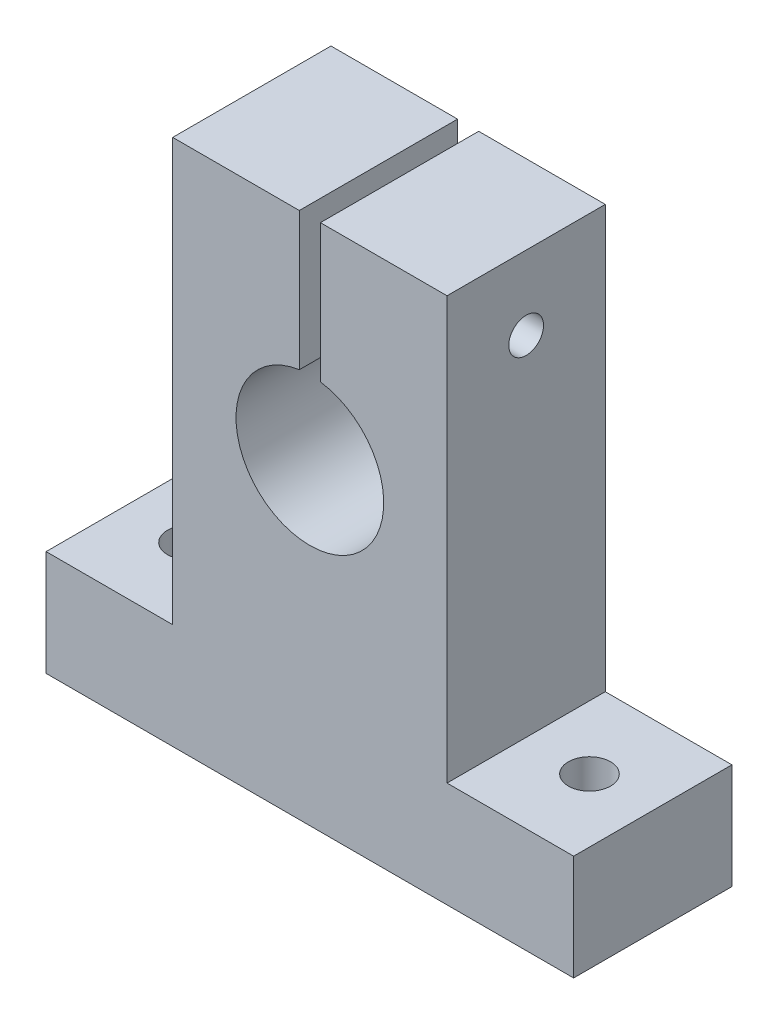
ISO-10303-21;
HEADER;
FILE_DESCRIPTION(('STEP AP214'),'2;1');
FILE_NAME('part.step','',(''),(''),'','','');
FILE_SCHEMA(('AUTOMOTIVE_DESIGN { 1 0 10303 214 1 1 1 1 }'));
ENDSEC;
DATA;
#1=APPLICATION_CONTEXT('core data for automotive mechanical design processes');
#2=APPLICATION_PROTOCOL_DEFINITION('international standard','automotive_design',2000,#1);
#3=PRODUCT_CONTEXT('',#1,'mechanical');
#4=PRODUCT('Part','Part','',(#3));
#5=PRODUCT_RELATED_PRODUCT_CATEGORY('part','',(#4));
#6=PRODUCT_DEFINITION_FORMATION('','',#4);
#7=PRODUCT_DEFINITION_CONTEXT('part definition',#1,'design');
#8=PRODUCT_DEFINITION('design','',#6,#7);
#9=PRODUCT_DEFINITION_SHAPE('','',#8);
#10=(LENGTH_UNIT() NAMED_UNIT(*) SI_UNIT(.MILLI.,.METRE.));
#11=(NAMED_UNIT(*) PLANE_ANGLE_UNIT() SI_UNIT($,.RADIAN.));
#12=(NAMED_UNIT(*) SI_UNIT($,.STERADIAN.) SOLID_ANGLE_UNIT());
#13=UNCERTAINTY_MEASURE_WITH_UNIT(LENGTH_MEASURE(1.E-05),#10,'distance_accuracy_value','');
#14=(GEOMETRIC_REPRESENTATION_CONTEXT(3) GLOBAL_UNCERTAINTY_ASSIGNED_CONTEXT((#13)) GLOBAL_UNIT_ASSIGNED_CONTEXT((#10,
#11,#12)) REPRESENTATION_CONTEXT('',''));
#15=CARTESIAN_POINT('',(0.,0.,0.));
#16=DIRECTION('',(0.,0.,1.));
#17=DIRECTION('',(1.,0.,0.));
#18=AXIS2_PLACEMENT_3D('',#15,#16,#17);
#19=CARTESIAN_POINT('',(0.,-40.,15.));
#20=DIRECTION('',(-1.,0.,0.));
#21=DIRECTION('',(0.,0.,1.));
#22=AXIS2_PLACEMENT_3D('',#19,#20,#21);
#23=PLANE('',#22);
#24=DIRECTION('',(0.,1.,0.));
#25=VECTOR('',#24,1.);
#26=CARTESIAN_POINT('',(0.,-40.,0.));
#27=LINE('',#26,#25);
#28=CARTESIAN_POINT('',(0.,-40.,0.));
#29=VERTEX_POINT('',#28);
#30=CARTESIAN_POINT('',(0.,0.,0.));
#31=VERTEX_POINT('',#30);
#32=EDGE_CURVE('E165',#29,#31,#27,.T.);
#33=ORIENTED_EDGE('',*,*,#32,.T.);
#34=DIRECTION('',(0.,0.,-1.));
#35=VECTOR('',#34,1.);
#36=CARTESIAN_POINT('',(0.,0.,15.));
#37=LINE('',#36,#35);
#38=CARTESIAN_POINT('',(0.,0.,15.));
#39=VERTEX_POINT('',#38);
#40=EDGE_CURVE('E201',#39,#31,#37,.T.);
#41=ORIENTED_EDGE('',*,*,#40,.F.);
#42=DIRECTION('',(0.,1.,0.));
#43=VECTOR('',#42,1.);
#44=CARTESIAN_POINT('',(0.,-40.,15.));
#45=LINE('',#44,#43);
#46=CARTESIAN_POINT('',(0.,-40.,15.));
#47=VERTEX_POINT('',#46);
#48=EDGE_CURVE('E224',#47,#39,#45,.T.);
#49=ORIENTED_EDGE('',*,*,#48,.F.);
#50=DIRECTION('',(0.,0.,-1.));
#51=VECTOR('',#50,1.);
#52=CARTESIAN_POINT('',(0.,-40.,15.));
#53=LINE('',#52,#51);
#54=EDGE_CURVE('E47',#47,#29,#53,.T.);
#55=ORIENTED_EDGE('',*,*,#54,.T.);
#56=EDGE_LOOP('',(#33,#41,#49,#55));
#57=FACE_BOUND('',#56,.T.);
#58=CARTESIAN_POINT('',(0.,-7.,7.5));
#59=DIRECTION('',(1.,0.,0.));
#60=DIRECTION('',(0.,0.,-1.));
#61=AXIS2_PLACEMENT_3D('',#58,#59,#60);
#62=CIRCLE('',#61,1.65);
#63=CARTESIAN_POINT('',(0.,-7.,5.85));
#64=VERTEX_POINT('',#63);
#65=EDGE_CURVE('E318',#64,#64,#62,.T.);
#66=ORIENTED_EDGE('',*,*,#65,.F.);
#67=EDGE_LOOP('',(#66));
#68=FACE_BOUND('',#67,.T.);
#69=ADVANCED_FACE('F37',(#57,#68),#23,.F.);
#70=CARTESIAN_POINT('',(12.,-50.,15.));
#71=DIRECTION('',(-1.,0.,0.));
#72=DIRECTION('',(0.,0.,1.));
#73=AXIS2_PLACEMENT_3D('',#70,#71,#72);
#74=PLANE('',#73);
#75=DIRECTION('',(0.,1.,0.));
#76=VECTOR('',#75,1.);
#77=CARTESIAN_POINT('',(12.,-50.,0.));
#78=LINE('',#77,#76);
#79=CARTESIAN_POINT('',(12.,-50.,0.));
#80=VERTEX_POINT('',#79);
#81=CARTESIAN_POINT('',(12.,-40.,0.));
#82=VERTEX_POINT('',#81);
#83=EDGE_CURVE('E160',#80,#82,#78,.T.);
#84=ORIENTED_EDGE('',*,*,#83,.T.);
#85=DIRECTION('',(0.,0.,-1.));
#86=VECTOR('',#85,1.);
#87=CARTESIAN_POINT('',(12.,-40.,15.));
#88=LINE('',#87,#86);
#89=CARTESIAN_POINT('',(12.,-40.,15.));
#90=VERTEX_POINT('',#89);
#91=EDGE_CURVE('E11',#90,#82,#88,.T.);
#92=ORIENTED_EDGE('',*,*,#91,.F.);
#93=DIRECTION('',(0.,1.,0.));
#94=VECTOR('',#93,1.);
#95=CARTESIAN_POINT('',(12.,-50.,15.));
#96=LINE('',#95,#94);
#97=CARTESIAN_POINT('',(12.,-50.,15.));
#98=VERTEX_POINT('',#97);
#99=EDGE_CURVE('E182',#98,#90,#96,.T.);
#100=ORIENTED_EDGE('',*,*,#99,.F.);
#101=DIRECTION('',(0.,0.,-1.));
#102=VECTOR('',#101,1.);
#103=CARTESIAN_POINT('',(12.,-50.,15.));
#104=LINE('',#103,#102);
#105=EDGE_CURVE('E156',#98,#80,#104,.T.);
#106=ORIENTED_EDGE('',*,*,#105,.T.);
#107=EDGE_LOOP('',(#84,#92,#100,#106));
#108=FACE_BOUND('',#107,.T.);
#109=ADVANCED_FACE('F39',(#108),#74,.F.);
#110=CARTESIAN_POINT('',(12.,-40.,15.));
#111=DIRECTION('',(0.,-1.,0.));
#112=DIRECTION('',(0.,0.,-1.));
#113=AXIS2_PLACEMENT_3D('',#110,#111,#112);
#114=PLANE('',#113);
#115=CARTESIAN_POINT('',(6.,-40.,7.5));
#116=DIRECTION('',(0.,1.,0.));
#117=DIRECTION('',(0.,0.,1.));
#118=AXIS2_PLACEMENT_3D('',#115,#116,#117);
#119=CIRCLE('',#118,2.);
#120=CARTESIAN_POINT('',(6.,-40.,9.5));
#121=VERTEX_POINT('',#120);
#122=EDGE_CURVE('E207',#121,#121,#119,.T.);
#123=ORIENTED_EDGE('',*,*,#122,.F.);
#124=EDGE_LOOP('',(#123));
#125=FACE_BOUND('',#124,.T.);
#126=DIRECTION('',(-1.,0.,0.));
#127=VECTOR('',#126,1.);
#128=CARTESIAN_POINT('',(12.,-40.,0.));
#129=LINE('',#128,#127);
#130=EDGE_CURVE('E163',#82,#29,#129,.T.);
#131=ORIENTED_EDGE('',*,*,#130,.T.);
#132=ORIENTED_EDGE('',*,*,#54,.F.);
#133=DIRECTION('',(-1.,0.,0.));
#134=VECTOR('',#133,1.);
#135=CARTESIAN_POINT('',(12.,-40.,15.));
#136=LINE('',#135,#134);
#137=EDGE_CURVE('E111',#90,#47,#136,.T.);
#138=ORIENTED_EDGE('',*,*,#137,.F.);
#139=ORIENTED_EDGE('',*,*,#91,.T.);
#140=EDGE_LOOP('',(#131,#132,#138,#139));
#141=FACE_BOUND('',#140,.T.);
#142=ADVANCED_FACE('F269',(#125,#141),#114,.F.);
#143=CARTESIAN_POINT('',(-12.,0.,15.));
#144=DIRECTION('',(0.,-1.,0.));
#145=DIRECTION('',(0.,0.,-1.));
#146=AXIS2_PLACEMENT_3D('',#143,#144,#145);
#147=PLANE('',#146);
#148=DIRECTION('',(-1.,0.,0.));
#149=VECTOR('',#148,1.);
#150=CARTESIAN_POINT('',(-12.,0.,0.));
#151=LINE('',#150,#149);
#152=CARTESIAN_POINT('',(-12.,0.,0.));
#153=VERTEX_POINT('',#152);
#154=EDGE_CURVE('E167',#31,#153,#151,.T.);
#155=ORIENTED_EDGE('',*,*,#154,.T.);
#156=DIRECTION('',(0.,0.,-1.));
#157=VECTOR('',#156,1.);
#158=CARTESIAN_POINT('',(-12.,0.,15.));
#159=LINE('',#158,#157);
#160=CARTESIAN_POINT('',(-12.,0.,15.));
#161=VERTEX_POINT('',#160);
#162=EDGE_CURVE('E198',#161,#153,#159,.T.);
#163=ORIENTED_EDGE('',*,*,#162,.F.);
#164=DIRECTION('',(-1.,0.,0.));
#165=VECTOR('',#164,1.);
#166=CARTESIAN_POINT('',(-12.,0.,15.));
#167=LINE('',#166,#165);
#168=EDGE_CURVE('E226',#39,#161,#167,.T.);
#169=ORIENTED_EDGE('',*,*,#168,.F.);
#170=ORIENTED_EDGE('',*,*,#40,.T.);
#171=EDGE_LOOP('',(#155,#163,#169,#170));
#172=FACE_BOUND('',#171,.T.);
#173=ADVANCED_FACE('F272',(#172),#147,.F.);
#174=CARTESIAN_POINT('',(-12.,0.,15.));
#175=DIRECTION('',(1.,0.,0.));
#176=DIRECTION('',(0.,1.,0.));
#177=AXIS2_PLACEMENT_3D('',#174,#175,#176);
#178=PLANE('',#177);
#179=CARTESIAN_POINT('',(-12.,-7.,7.5));
#180=DIRECTION('',(1.,0.,0.));
#181=DIRECTION('',(0.,1.,0.));
#182=AXIS2_PLACEMENT_3D('',#179,#180,#181);
#183=CIRCLE('',#182,1.65);
#184=CARTESIAN_POINT('',(-12.,-5.35,7.5));
#185=VERTEX_POINT('',#184);
#186=EDGE_CURVE('E315',#185,#185,#183,.T.);
#187=ORIENTED_EDGE('',*,*,#186,.T.);
#188=EDGE_LOOP('',(#187));
#189=FACE_BOUND('',#188,.T.);
#190=DIRECTION('',(0.,-1.,0.));
#191=VECTOR('',#190,1.);
#192=CARTESIAN_POINT('',(-12.,0.,0.));
#193=LINE('',#192,#191);
#194=CARTESIAN_POINT('',(-12.,-13.0717967697245,0.));
#195=VERTEX_POINT('',#194);
#196=EDGE_CURVE('E169',#153,#195,#193,.T.);
#197=ORIENTED_EDGE('',*,*,#196,.T.);
#198=DIRECTION('',(0.,0.,-1.));
#199=VECTOR('',#198,1.);
#200=CARTESIAN_POINT('',(-12.,-13.0717967697245,15.));
#201=LINE('',#200,#199);
#202=CARTESIAN_POINT('',(-12.,-13.0717967697245,15.));
#203=VERTEX_POINT('',#202);
#204=EDGE_CURVE('E195',#203,#195,#201,.T.);
#205=ORIENTED_EDGE('',*,*,#204,.F.);
#206=DIRECTION('',(0.,-1.,0.));
#207=VECTOR('',#206,1.);
#208=CARTESIAN_POINT('',(-12.,0.,15.));
#209=LINE('',#208,#207);
#210=EDGE_CURVE('E228',#161,#203,#209,.T.);
#211=ORIENTED_EDGE('',*,*,#210,.F.);
#212=ORIENTED_EDGE('',*,*,#162,.T.);
#213=EDGE_LOOP('',(#197,#205,#211,#212));
#214=FACE_BOUND('',#213,.T.);
#215=ADVANCED_FACE('F279',(#189,#214),#178,.F.);
#216=CARTESIAN_POINT('',(-13.,-20.,15.));
#217=DIRECTION('',(0.,0.,-1.));
#218=DIRECTION('',(-1.,0.,0.));
#219=AXIS2_PLACEMENT_3D('',#216,#217,#218);
#220=CYLINDRICAL_SURFACE('',#219,7.);
#221=CARTESIAN_POINT('',(-13.,-20.,0.));
#222=DIRECTION('',(0.,0.,-1.));
#223=DIRECTION('',(1.,0.,0.));
#224=AXIS2_PLACEMENT_3D('',#221,#222,#223);
#225=CIRCLE('',#224,7.);
#226=CARTESIAN_POINT('',(-14.,-13.0717967697245,0.));
#227=VERTEX_POINT('',#226);
#228=EDGE_CURVE('E171',#195,#227,#225,.T.);
#229=ORIENTED_EDGE('',*,*,#228,.T.);
#230=DIRECTION('',(0.,0.,-1.));
#231=VECTOR('',#230,1.);
#232=CARTESIAN_POINT('',(-14.,-13.0717967697245,15.));
#233=LINE('',#232,#231);
#234=CARTESIAN_POINT('',(-14.,-13.0717967697245,15.));
#235=VERTEX_POINT('',#234);
#236=EDGE_CURVE('E192',#235,#227,#233,.T.);
#237=ORIENTED_EDGE('',*,*,#236,.F.);
#238=CARTESIAN_POINT('',(-13.,-20.,15.));
#239=DIRECTION('',(0.,0.,-1.));
#240=DIRECTION('',(1.,0.,0.));
#241=AXIS2_PLACEMENT_3D('',#238,#239,#240);
#242=CIRCLE('',#241,7.);
#243=EDGE_CURVE('E230',#203,#235,#242,.T.);
#244=ORIENTED_EDGE('',*,*,#243,.F.);
#245=ORIENTED_EDGE('',*,*,#204,.T.);
#246=EDGE_LOOP('',(#229,#237,#244,#245));
#247=FACE_BOUND('',#246,.T.);
#248=ADVANCED_FACE('F294',(#247),#220,.F.);
#249=CARTESIAN_POINT('',(-14.,0.,15.));
#250=DIRECTION('',(-1.,0.,0.));
#251=DIRECTION('',(0.,-1.,0.));
#252=AXIS2_PLACEMENT_3D('',#249,#250,#251);
#253=PLANE('',#252);
#254=CARTESIAN_POINT('',(-14.,-7.,7.56985297052041));
#255=DIRECTION('',(-1.,0.,0.));
#256=DIRECTION('',(0.,-1.,0.));
#257=AXIS2_PLACEMENT_3D('',#254,#255,#256);
#258=CIRCLE('',#257,2.15);
#259=CARTESIAN_POINT('',(-14.,-9.15,7.56985297052041));
#260=VERTEX_POINT('',#259);
#261=EDGE_CURVE('E217',#260,#260,#258,.T.);
#262=ORIENTED_EDGE('',*,*,#261,.T.);
#263=EDGE_LOOP('',(#262));
#264=FACE_BOUND('',#263,.T.);
#265=DIRECTION('',(0.,1.,0.));
#266=VECTOR('',#265,1.);
#267=CARTESIAN_POINT('',(-14.,0.,0.));
#268=LINE('',#267,#266);
#269=CARTESIAN_POINT('',(-14.,0.,0.));
#270=VERTEX_POINT('',#269);
#271=EDGE_CURVE('E173',#227,#270,#268,.T.);
#272=ORIENTED_EDGE('',*,*,#271,.T.);
#273=DIRECTION('',(0.,0.,-1.));
#274=VECTOR('',#273,1.);
#275=CARTESIAN_POINT('',(-14.,0.,15.));
#276=LINE('',#275,#274);
#277=CARTESIAN_POINT('',(-14.,0.,15.));
#278=VERTEX_POINT('',#277);
#279=EDGE_CURVE('E189',#278,#270,#276,.T.);
#280=ORIENTED_EDGE('',*,*,#279,.F.);
#281=DIRECTION('',(0.,1.,0.));
#282=VECTOR('',#281,1.);
#283=CARTESIAN_POINT('',(-14.,0.,15.));
#284=LINE('',#283,#282);
#285=EDGE_CURVE('E232',#235,#278,#284,.T.);
#286=ORIENTED_EDGE('',*,*,#285,.F.);
#287=ORIENTED_EDGE('',*,*,#236,.T.);
#288=EDGE_LOOP('',(#272,#280,#286,#287));
#289=FACE_BOUND('',#288,.T.);
#290=ADVANCED_FACE('F297',(#264,#289),#253,.F.);
#291=CARTESIAN_POINT('',(-26.,0.,15.));
#292=DIRECTION('',(0.,-1.,0.));
#293=DIRECTION('',(0.,0.,-1.));
#294=AXIS2_PLACEMENT_3D('',#291,#292,#293);
#295=PLANE('',#294);
#296=DIRECTION('',(-1.,0.,0.));
#297=VECTOR('',#296,1.);
#298=CARTESIAN_POINT('',(-26.,0.,0.));
#299=LINE('',#298,#297);
#300=CARTESIAN_POINT('',(-26.,0.,0.));
#301=VERTEX_POINT('',#300);
#302=EDGE_CURVE('E175',#270,#301,#299,.T.);
#303=ORIENTED_EDGE('',*,*,#302,.T.);
#304=DIRECTION('',(0.,0.,-1.));
#305=VECTOR('',#304,1.);
#306=CARTESIAN_POINT('',(-26.,0.,15.));
#307=LINE('',#306,#305);
#308=CARTESIAN_POINT('',(-26.,0.,15.));
#309=VERTEX_POINT('',#308);
#310=EDGE_CURVE('E186',#309,#301,#307,.T.);
#311=ORIENTED_EDGE('',*,*,#310,.F.);
#312=DIRECTION('',(-1.,0.,0.));
#313=VECTOR('',#312,1.);
#314=CARTESIAN_POINT('',(-26.,0.,15.));
#315=LINE('',#314,#313);
#316=EDGE_CURVE('E234',#278,#309,#315,.T.);
#317=ORIENTED_EDGE('',*,*,#316,.F.);
#318=ORIENTED_EDGE('',*,*,#279,.T.);
#319=EDGE_LOOP('',(#303,#311,#317,#318));
#320=FACE_BOUND('',#319,.T.);
#321=ADVANCED_FACE('F240',(#320),#295,.F.);
#322=CARTESIAN_POINT('',(-26.,0.,15.));
#323=DIRECTION('',(1.,0.,0.));
#324=DIRECTION('',(0.,1.,0.));
#325=AXIS2_PLACEMENT_3D('',#322,#323,#324);
#326=PLANE('',#325);
#327=CARTESIAN_POINT('',(-26.,-7.,7.56985297052041));
#328=DIRECTION('',(-1.,0.,0.));
#329=DIRECTION('',(0.,0.,1.));
#330=AXIS2_PLACEMENT_3D('',#327,#328,#329);
#331=CIRCLE('',#330,4.);
#332=CARTESIAN_POINT('',(-26.,-7.,11.5698529705204));
#333=VERTEX_POINT('',#332);
#334=EDGE_CURVE('E317',#333,#333,#331,.T.);
#335=ORIENTED_EDGE('',*,*,#334,.F.);
#336=EDGE_LOOP('',(#335));
#337=FACE_BOUND('',#336,.T.);
#338=DIRECTION('',(0.,-1.,0.));
#339=VECTOR('',#338,1.);
#340=CARTESIAN_POINT('',(-26.,0.,0.));
#341=LINE('',#340,#339);
#342=CARTESIAN_POINT('',(-26.,-40.,0.));
#343=VERTEX_POINT('',#342);
#344=EDGE_CURVE('E177',#301,#343,#341,.T.);
#345=ORIENTED_EDGE('',*,*,#344,.T.);
#346=DIRECTION('',(0.,0.,-1.));
#347=VECTOR('',#346,1.);
#348=CARTESIAN_POINT('',(-26.,-40.,15.));
#349=LINE('',#348,#347);
#350=CARTESIAN_POINT('',(-26.,-40.,15.));
#351=VERTEX_POINT('',#350);
#352=EDGE_CURVE('E151',#351,#343,#349,.T.);
#353=ORIENTED_EDGE('',*,*,#352,.F.);
#354=DIRECTION('',(0.,-1.,0.));
#355=VECTOR('',#354,1.);
#356=CARTESIAN_POINT('',(-26.,0.,15.));
#357=LINE('',#356,#355);
#358=EDGE_CURVE('E142',#309,#351,#357,.T.);
#359=ORIENTED_EDGE('',*,*,#358,.F.);
#360=ORIENTED_EDGE('',*,*,#310,.T.);
#361=EDGE_LOOP('',(#345,#353,#359,#360));
#362=FACE_BOUND('',#361,.T.);
#363=ADVANCED_FACE('F244',(#337,#362),#326,.F.);
#364=CARTESIAN_POINT('',(-26.,-40.,15.));
#365=DIRECTION('',(0.,-1.,0.));
#366=DIRECTION('',(1.,0.,0.));
#367=AXIS2_PLACEMENT_3D('',#364,#365,#366);
#368=PLANE('',#367);
#369=CARTESIAN_POINT('',(-32.,-40.,7.5));
#370=DIRECTION('',(0.,1.,0.));
#371=DIRECTION('',(0.,0.,1.));
#372=AXIS2_PLACEMENT_3D('',#369,#370,#371);
#373=CIRCLE('',#372,2.);
#374=CARTESIAN_POINT('',(-32.,-40.,9.5));
#375=VERTEX_POINT('',#374);
#376=EDGE_CURVE('E212',#375,#375,#373,.T.);
#377=ORIENTED_EDGE('',*,*,#376,.F.);
#378=EDGE_LOOP('',(#377));
#379=FACE_BOUND('',#378,.T.);
#380=DIRECTION('',(-1.,0.,0.));
#381=VECTOR('',#380,1.);
#382=CARTESIAN_POINT('',(-26.,-40.,0.));
#383=LINE('',#382,#381);
#384=CARTESIAN_POINT('',(-38.,-40.,0.));
#385=VERTEX_POINT('',#384);
#386=EDGE_CURVE('E150',#343,#385,#383,.T.);
#387=ORIENTED_EDGE('',*,*,#386,.T.);
#388=DIRECTION('',(0.,0.,-1.));
#389=VECTOR('',#388,1.);
#390=CARTESIAN_POINT('',(-38.,-40.,15.));
#391=LINE('',#390,#389);
#392=CARTESIAN_POINT('',(-38.,-40.,15.));
#393=VERTEX_POINT('',#392);
#394=EDGE_CURVE('E147',#393,#385,#391,.T.);
#395=ORIENTED_EDGE('',*,*,#394,.F.);
#396=DIRECTION('',(-1.,0.,0.));
#397=VECTOR('',#396,1.);
#398=CARTESIAN_POINT('',(-26.,-40.,15.));
#399=LINE('',#398,#397);
#400=EDGE_CURVE('E136',#351,#393,#399,.T.);
#401=ORIENTED_EDGE('',*,*,#400,.F.);
#402=ORIENTED_EDGE('',*,*,#352,.T.);
#403=EDGE_LOOP('',(#387,#395,#401,#402));
#404=FACE_BOUND('',#403,.T.);
#405=ADVANCED_FACE('F148',(#379,#404),#368,.F.);
#406=CARTESIAN_POINT('',(-38.,-40.,15.));
#407=DIRECTION('',(1.,0.,0.));
#408=DIRECTION('',(0.,0.,-1.));
#409=AXIS2_PLACEMENT_3D('',#406,#407,#408);
#410=PLANE('',#409);
#411=DIRECTION('',(0.,-1.,0.));
#412=VECTOR('',#411,1.);
#413=CARTESIAN_POINT('',(-38.,-40.,0.));
#414=LINE('',#413,#412);
#415=CARTESIAN_POINT('',(-38.,-50.,0.));
#416=VERTEX_POINT('',#415);
#417=EDGE_CURVE('E97',#385,#416,#414,.T.);
#418=ORIENTED_EDGE('',*,*,#417,.T.);
#419=DIRECTION('',(0.,0.,-1.));
#420=VECTOR('',#419,1.);
#421=CARTESIAN_POINT('',(-38.,-50.,15.));
#422=LINE('',#421,#420);
#423=CARTESIAN_POINT('',(-38.,-50.,15.));
#424=VERTEX_POINT('',#423);
#425=EDGE_CURVE('E152',#424,#416,#422,.T.);
#426=ORIENTED_EDGE('',*,*,#425,.F.);
#427=DIRECTION('',(0.,-1.,0.));
#428=VECTOR('',#427,1.);
#429=CARTESIAN_POINT('',(-38.,-40.,15.));
#430=LINE('',#429,#428);
#431=EDGE_CURVE('E140',#393,#424,#430,.T.);
#432=ORIENTED_EDGE('',*,*,#431,.F.);
#433=ORIENTED_EDGE('',*,*,#394,.T.);
#434=EDGE_LOOP('',(#418,#426,#432,#433));
#435=FACE_BOUND('',#434,.T.);
#436=ADVANCED_FACE('F154',(#435),#410,.F.);
#437=CARTESIAN_POINT('',(-38.,-50.,15.));
#438=DIRECTION('',(0.,1.,0.));
#439=DIRECTION('',(0.,0.,1.));
#440=AXIS2_PLACEMENT_3D('',#437,#438,#439);
#441=PLANE('',#440);
#442=CARTESIAN_POINT('',(6.,-50.,7.5));
#443=DIRECTION('',(0.,1.,0.));
#444=DIRECTION('',(0.,0.,1.));
#445=AXIS2_PLACEMENT_3D('',#442,#443,#444);
#446=CIRCLE('',#445,2.);
#447=CARTESIAN_POINT('',(6.,-50.,9.5));
#448=VERTEX_POINT('',#447);
#449=EDGE_CURVE('E41',#448,#448,#446,.T.);
#450=ORIENTED_EDGE('',*,*,#449,.T.);
#451=EDGE_LOOP('',(#450));
#452=FACE_BOUND('',#451,.T.);
#453=CARTESIAN_POINT('',(-32.,-50.,7.5));
#454=DIRECTION('',(0.,1.,0.));
#455=DIRECTION('',(0.,0.,1.));
#456=AXIS2_PLACEMENT_3D('',#453,#454,#455);
#457=CIRCLE('',#456,2.);
#458=CARTESIAN_POINT('',(-32.,-50.,9.5));
#459=VERTEX_POINT('',#458);
#460=EDGE_CURVE('E205',#459,#459,#457,.T.);
#461=ORIENTED_EDGE('',*,*,#460,.T.);
#462=EDGE_LOOP('',(#461));
#463=FACE_BOUND('',#462,.T.);
#464=DIRECTION('',(1.,0.,0.));
#465=VECTOR('',#464,1.);
#466=CARTESIAN_POINT('',(-38.,-50.,0.));
#467=LINE('',#466,#465);
#468=EDGE_CURVE('E103',#416,#80,#467,.T.);
#469=ORIENTED_EDGE('',*,*,#468,.T.);
#470=ORIENTED_EDGE('',*,*,#105,.F.);
#471=DIRECTION('',(1.,0.,0.));
#472=VECTOR('',#471,1.);
#473=CARTESIAN_POINT('',(-38.,-50.,15.));
#474=LINE('',#473,#472);
#475=EDGE_CURVE('E56',#424,#98,#474,.T.);
#476=ORIENTED_EDGE('',*,*,#475,.F.);
#477=ORIENTED_EDGE('',*,*,#425,.T.);
#478=EDGE_LOOP('',(#469,#470,#476,#477));
#479=FACE_BOUND('',#478,.T.);
#480=ADVANCED_FACE('F252',(#452,#463,#479),#441,.F.);
#481=CARTESIAN_POINT('',(-13.,-20.,15.));
#482=DIRECTION('',(0.,0.,1.));
#483=DIRECTION('',(1.,0.,0.));
#484=AXIS2_PLACEMENT_3D('',#481,#482,#483);
#485=PLANE('',#484);
#486=ORIENTED_EDGE('',*,*,#99,.T.);
#487=ORIENTED_EDGE('',*,*,#137,.T.);
#488=ORIENTED_EDGE('',*,*,#48,.T.);
#489=ORIENTED_EDGE('',*,*,#168,.T.);
#490=ORIENTED_EDGE('',*,*,#210,.T.);
#491=ORIENTED_EDGE('',*,*,#243,.T.);
#492=ORIENTED_EDGE('',*,*,#285,.T.);
#493=ORIENTED_EDGE('',*,*,#316,.T.);
#494=ORIENTED_EDGE('',*,*,#358,.T.);
#495=ORIENTED_EDGE('',*,*,#400,.T.);
#496=ORIENTED_EDGE('',*,*,#431,.T.);
#497=ORIENTED_EDGE('',*,*,#475,.T.);
#498=EDGE_LOOP('',(#486,#487,#488,#489,#490,#491,#492,#493,#494,#495,#496,#497));
#499=FACE_BOUND('',#498,.T.);
#500=ADVANCED_FACE('F138',(#499),#485,.T.);
#501=CARTESIAN_POINT('',(-13.,-20.,0.));
#502=DIRECTION('',(0.,0.,1.));
#503=DIRECTION('',(1.,0.,0.));
#504=AXIS2_PLACEMENT_3D('',#501,#502,#503);
#505=PLANE('',#504);
#506=ORIENTED_EDGE('',*,*,#83,.F.);
#507=ORIENTED_EDGE('',*,*,#468,.F.);
#508=ORIENTED_EDGE('',*,*,#417,.F.);
#509=ORIENTED_EDGE('',*,*,#386,.F.);
#510=ORIENTED_EDGE('',*,*,#344,.F.);
#511=ORIENTED_EDGE('',*,*,#302,.F.);
#512=ORIENTED_EDGE('',*,*,#271,.F.);
#513=ORIENTED_EDGE('',*,*,#228,.F.);
#514=ORIENTED_EDGE('',*,*,#196,.F.);
#515=ORIENTED_EDGE('',*,*,#154,.F.);
#516=ORIENTED_EDGE('',*,*,#32,.F.);
#517=ORIENTED_EDGE('',*,*,#130,.F.);
#518=EDGE_LOOP('',(#506,#507,#508,#509,#510,#511,#512,#513,#514,#515,#516,#517));
#519=FACE_BOUND('',#518,.T.);
#520=ADVANCED_FACE('F247',(#519),#505,.F.);
#521=CARTESIAN_POINT('',(-32.,-55.,7.5));
#522=DIRECTION('',(0.,1.,0.));
#523=DIRECTION('',(0.,0.,1.));
#524=AXIS2_PLACEMENT_3D('',#521,#522,#523);
#525=CYLINDRICAL_SURFACE('',#524,2.);
#526=ORIENTED_EDGE('',*,*,#376,.T.);
#527=EDGE_LOOP('',(#526));
#528=FACE_BOUND('',#527,.T.);
#529=ORIENTED_EDGE('',*,*,#460,.F.);
#530=EDGE_LOOP('',(#529));
#531=FACE_BOUND('',#530,.T.);
#532=ADVANCED_FACE('F345',(#528,#531),#525,.F.);
#533=CARTESIAN_POINT('',(6.,-55.,7.5));
#534=DIRECTION('',(0.,1.,0.));
#535=DIRECTION('',(0.,0.,1.));
#536=AXIS2_PLACEMENT_3D('',#533,#534,#535);
#537=CYLINDRICAL_SURFACE('',#536,2.);
#538=ORIENTED_EDGE('',*,*,#122,.T.);
#539=EDGE_LOOP('',(#538));
#540=FACE_BOUND('',#539,.T.);
#541=ORIENTED_EDGE('',*,*,#449,.F.);
#542=EDGE_LOOP('',(#541));
#543=FACE_BOUND('',#542,.T.);
#544=ADVANCED_FACE('F336',(#540,#543),#537,.F.);
#545=CARTESIAN_POINT('',(-26.,-7.,7.56985297052041));
#546=DIRECTION('',(-1.,0.,0.));
#547=DIRECTION('',(0.,0.,1.));
#548=AXIS2_PLACEMENT_3D('',#545,#546,#547);
#549=CYLINDRICAL_SURFACE('',#548,2.15);
#550=ORIENTED_EDGE('',*,*,#261,.F.);
#551=EDGE_LOOP('',(#550));
#552=FACE_BOUND('',#551,.T.);
#553=CARTESIAN_POINT('',(-21.6,-7.,7.56985297052041));
#554=DIRECTION('',(-1.,0.,0.));
#555=DIRECTION('',(0.,0.,1.));
#556=AXIS2_PLACEMENT_3D('',#553,#554,#555);
#557=CIRCLE('',#556,2.15);
#558=CARTESIAN_POINT('',(-21.6,-7.,9.71985297052041));
#559=VERTEX_POINT('',#558);
#560=EDGE_CURVE('E327',#559,#559,#557,.T.);
#561=ORIENTED_EDGE('',*,*,#560,.T.);
#562=EDGE_LOOP('',(#561));
#563=FACE_BOUND('',#562,.T.);
#564=ADVANCED_FACE('F333',(#552,#563),#549,.F.);
#565=CARTESIAN_POINT('',(-21.6,-4.85,7.56985297052041));
#566=DIRECTION('',(1.,0.,0.));
#567=DIRECTION('',(0.,0.,-1.));
#568=AXIS2_PLACEMENT_3D('',#565,#566,#567);
#569=PLANE('',#568);
#570=ORIENTED_EDGE('',*,*,#560,.F.);
#571=EDGE_LOOP('',(#570));
#572=FACE_BOUND('',#571,.T.);
#573=CARTESIAN_POINT('',(-21.6,-7.,7.56985297052041));
#574=DIRECTION('',(-1.,0.,0.));
#575=DIRECTION('',(0.,0.,1.));
#576=AXIS2_PLACEMENT_3D('',#573,#574,#575);
#577=CIRCLE('',#576,4.);
#578=CARTESIAN_POINT('',(-21.6,-7.,11.5698529705204));
#579=VERTEX_POINT('',#578);
#580=EDGE_CURVE('E321',#579,#579,#577,.T.);
#581=ORIENTED_EDGE('',*,*,#580,.T.);
#582=EDGE_LOOP('',(#581));
#583=FACE_BOUND('',#582,.T.);
#584=ADVANCED_FACE('F335',(#572,#583),#569,.F.);
#585=CARTESIAN_POINT('',(-26.,-7.,7.56985297052041));
#586=DIRECTION('',(-1.,0.,0.));
#587=DIRECTION('',(0.,0.,1.));
#588=AXIS2_PLACEMENT_3D('',#585,#586,#587);
#589=CYLINDRICAL_SURFACE('',#588,4.);
#590=ORIENTED_EDGE('',*,*,#580,.F.);
#591=EDGE_LOOP('',(#590));
#592=FACE_BOUND('',#591,.T.);
#593=ORIENTED_EDGE('',*,*,#334,.T.);
#594=EDGE_LOOP('',(#593));
#595=FACE_BOUND('',#594,.T.);
#596=ADVANCED_FACE('F342',(#592,#595),#589,.F.);
#597=CARTESIAN_POINT('',(0.,-7.,7.5));
#598=DIRECTION('',(1.,0.,0.));
#599=DIRECTION('',(0.,0.,-1.));
#600=AXIS2_PLACEMENT_3D('',#597,#598,#599);
#601=CYLINDRICAL_SURFACE('',#600,1.65);
#602=ORIENTED_EDGE('',*,*,#186,.F.);
#603=EDGE_LOOP('',(#602));
#604=FACE_BOUND('',#603,.T.);
#605=ORIENTED_EDGE('',*,*,#65,.T.);
#606=EDGE_LOOP('',(#605));
#607=FACE_BOUND('',#606,.T.);
#608=ADVANCED_FACE('F398',(#604,#607),#601,.F.);
#609=CLOSED_SHELL('',(#69,#109,#142,#173,#215,#248,#290,#321,#363,#405,#436,#480,#500,#520,#532,
#544,#564,#584,#596,#608));
#610=MANIFOLD_SOLID_BREP('B2',#609);
#611=ADVANCED_BREP_SHAPE_REPRESENTATION('',(#18,#610),#14);
#612=SHAPE_DEFINITION_REPRESENTATION(#9,#611);
ENDSEC;
END-ISO-10303-21;
